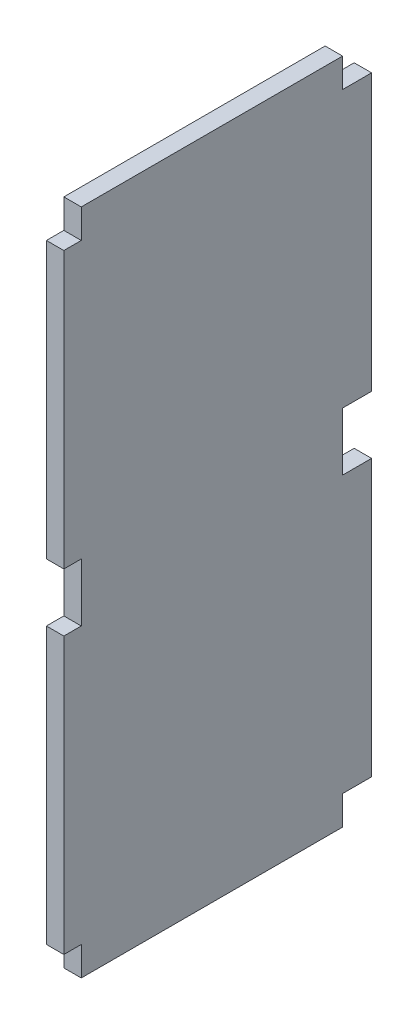
ISO-10303-21;
HEADER;
FILE_DESCRIPTION(('STEP AP214'),'2;1');
FILE_NAME('part.step','',(''),(''),'','','');
FILE_SCHEMA(('AUTOMOTIVE_DESIGN { 1 0 10303 214 1 1 1 1 }'));
ENDSEC;
DATA;
#1=APPLICATION_CONTEXT('core data for automotive mechanical design processes');
#2=APPLICATION_PROTOCOL_DEFINITION('international standard','automotive_design',2000,#1);
#3=PRODUCT_CONTEXT('',#1,'mechanical');
#4=PRODUCT('Part','Part','',(#3));
#5=PRODUCT_RELATED_PRODUCT_CATEGORY('part','',(#4));
#6=PRODUCT_DEFINITION_FORMATION('','',#4);
#7=PRODUCT_DEFINITION_CONTEXT('part definition',#1,'design');
#8=PRODUCT_DEFINITION('design','',#6,#7);
#9=PRODUCT_DEFINITION_SHAPE('','',#8);
#10=(LENGTH_UNIT() NAMED_UNIT(*) SI_UNIT(.MILLI.,.METRE.));
#11=(NAMED_UNIT(*) PLANE_ANGLE_UNIT() SI_UNIT($,.RADIAN.));
#12=(NAMED_UNIT(*) SI_UNIT($,.STERADIAN.) SOLID_ANGLE_UNIT());
#13=UNCERTAINTY_MEASURE_WITH_UNIT(LENGTH_MEASURE(1.E-05),#10,'distance_accuracy_value','');
#14=(GEOMETRIC_REPRESENTATION_CONTEXT(3) GLOBAL_UNCERTAINTY_ASSIGNED_CONTEXT((#13)) GLOBAL_UNIT_ASSIGNED_CONTEXT((#10,
#11,#12)) REPRESENTATION_CONTEXT('',''));
#15=CARTESIAN_POINT('',(0.,0.,0.));
#16=DIRECTION('',(0.,0.,1.));
#17=DIRECTION('',(1.,0.,0.));
#18=AXIS2_PLACEMENT_3D('',#15,#16,#17);
#19=CARTESIAN_POINT('',(6.49999999999999,52.5,153.04284840007));
#20=DIRECTION('',(0.,-1.,0.));
#21=DIRECTION('',(0.,0.,-1.));
#22=AXIS2_PLACEMENT_3D('',#19,#20,#21);
#23=PLANE('',#22);
#24=DIRECTION('',(0.,0.,-1.));
#25=VECTOR('',#24,1.);
#26=CARTESIAN_POINT('',(3.49999999999999,52.5,153.04284840007));
#27=LINE('',#26,#25);
#28=CARTESIAN_POINT('',(3.49999999999999,52.5,0.));
#29=VERTEX_POINT('',#28);
#30=CARTESIAN_POINT('',(3.49999999999999,52.5,-5.00000000000003));
#31=VERTEX_POINT('',#30);
#32=EDGE_CURVE('E213',#29,#31,#27,.T.);
#33=ORIENTED_EDGE('',*,*,#32,.F.);
#34=DIRECTION('',(1.,0.,0.));
#35=VECTOR('',#34,1.);
#36=CARTESIAN_POINT('',(3.49999999999999,52.5,0.));
#37=LINE('',#36,#35);
#38=CARTESIAN_POINT('',(6.50000000000004,52.5,0.));
#39=VERTEX_POINT('',#38);
#40=EDGE_CURVE('E197',#29,#39,#37,.T.);
#41=ORIENTED_EDGE('',*,*,#40,.T.);
#42=DIRECTION('',(0.,0.,-1.));
#43=VECTOR('',#42,1.);
#44=CARTESIAN_POINT('',(6.49999999999999,52.5,153.04284840007));
#45=LINE('',#44,#43);
#46=CARTESIAN_POINT('',(6.49999999999999,52.5,-5.));
#47=VERTEX_POINT('',#46);
#48=EDGE_CURVE('E241',#39,#47,#45,.T.);
#49=ORIENTED_EDGE('',*,*,#48,.T.);
#50=DIRECTION('',(1.,0.,0.));
#51=VECTOR('',#50,1.);
#52=CARTESIAN_POINT('',(6.49999999999999,52.5,-5.));
#53=LINE('',#52,#51);
#54=EDGE_CURVE('E237',#31,#47,#53,.T.);
#55=ORIENTED_EDGE('',*,*,#54,.F.);
#56=EDGE_LOOP('',(#33,#41,#49,#55));
#57=FACE_BOUND('',#56,.T.);
#58=ADVANCED_FACE('F39',(#57),#23,.F.);
#59=CARTESIAN_POINT('',(6.50000000000001,-52.5,153.04284840007));
#60=DIRECTION('',(0.,1.,0.));
#61=DIRECTION('',(0.,0.,1.));
#62=AXIS2_PLACEMENT_3D('',#59,#60,#61);
#63=PLANE('',#62);
#64=DIRECTION('',(-1.,0.,0.));
#65=VECTOR('',#64,1.);
#66=CARTESIAN_POINT('',(3.49999999999999,-52.5,45.));
#67=LINE('',#66,#65);
#68=CARTESIAN_POINT('',(6.50000000000001,-52.5,45.));
#69=VERTEX_POINT('',#68);
#70=CARTESIAN_POINT('',(3.5,-52.5,45.));
#71=VERTEX_POINT('',#70);
#72=EDGE_CURVE('E64',#69,#71,#67,.T.);
#73=ORIENTED_EDGE('',*,*,#72,.F.);
#74=DIRECTION('',(0.,0.,-1.));
#75=VECTOR('',#74,1.);
#76=CARTESIAN_POINT('',(6.50000000000001,-52.5,153.04284840007));
#77=LINE('',#76,#75);
#78=CARTESIAN_POINT('',(6.50000000000001,-52.5,48.));
#79=VERTEX_POINT('',#78);
#80=EDGE_CURVE('E246',#79,#69,#77,.T.);
#81=ORIENTED_EDGE('',*,*,#80,.F.);
#82=DIRECTION('',(1.,0.,0.));
#83=VECTOR('',#82,1.);
#84=CARTESIAN_POINT('',(6.50000000000001,-52.5,48.));
#85=LINE('',#84,#83);
#86=CARTESIAN_POINT('',(3.5,-52.5,48.));
#87=VERTEX_POINT('',#86);
#88=EDGE_CURVE('E254',#87,#79,#85,.T.);
#89=ORIENTED_EDGE('',*,*,#88,.F.);
#90=DIRECTION('',(0.,0.,-1.));
#91=VECTOR('',#90,1.);
#92=CARTESIAN_POINT('',(3.5,-52.5,153.04284840007));
#93=LINE('',#92,#91);
#94=EDGE_CURVE('E268',#87,#71,#93,.T.);
#95=ORIENTED_EDGE('',*,*,#94,.T.);
#96=EDGE_LOOP('',(#73,#81,#89,#95));
#97=FACE_BOUND('',#96,.T.);
#98=ADVANCED_FACE('F311',(#97),#63,.F.);
#99=DIRECTION('',(1.,0.,0.));
#100=VECTOR('',#99,1.);
#101=CARTESIAN_POINT('',(3.49999999999999,-52.5,0.));
#102=LINE('',#101,#100);
#103=CARTESIAN_POINT('',(3.5,-52.5,0.));
#104=VERTEX_POINT('',#103);
#105=CARTESIAN_POINT('',(6.50000000000004,-52.5,0.));
#106=VERTEX_POINT('',#105);
#107=EDGE_CURVE('E186',#104,#106,#102,.T.);
#108=ORIENTED_EDGE('',*,*,#107,.F.);
#109=CARTESIAN_POINT('',(3.5,-52.5,-5.));
#110=VERTEX_POINT('',#109);
#111=EDGE_CURVE('E239',#104,#110,#93,.T.);
#112=ORIENTED_EDGE('',*,*,#111,.T.);
#113=DIRECTION('',(-1.,0.,0.));
#114=VECTOR('',#113,1.);
#115=CARTESIAN_POINT('',(6.50000000000001,-52.5,-5.));
#116=LINE('',#115,#114);
#117=CARTESIAN_POINT('',(6.50000000000001,-52.5,-5.));
#118=VERTEX_POINT('',#117);
#119=EDGE_CURVE('E348',#118,#110,#116,.T.);
#120=ORIENTED_EDGE('',*,*,#119,.F.);
#121=EDGE_CURVE('E315',#106,#118,#77,.T.);
#122=ORIENTED_EDGE('',*,*,#121,.F.);
#123=EDGE_LOOP('',(#108,#112,#120,#122));
#124=FACE_BOUND('',#123,.T.);
#125=ADVANCED_FACE('F362',(#124),#63,.F.);
#126=CARTESIAN_POINT('',(0.,0.,-5.));
#127=DIRECTION('',(0.,0.,1.));
#128=DIRECTION('',(0.,-1.,0.));
#129=AXIS2_PLACEMENT_3D('',#126,#127,#128);
#130=PLANE('',#129);
#131=DIRECTION('',(0.,1.,0.));
#132=VECTOR('',#131,1.);
#133=CARTESIAN_POINT('',(3.49999999999999,52.5,-5.));
#134=LINE('',#133,#132);
#135=CARTESIAN_POINT('',(3.49999999999999,-5.,-5.));
#136=VERTEX_POINT('',#135);
#137=EDGE_CURVE('E345',#110,#136,#134,.T.);
#138=ORIENTED_EDGE('',*,*,#137,.T.);
#139=DIRECTION('',(1.,0.,0.));
#140=VECTOR('',#139,1.);
#141=CARTESIAN_POINT('',(0.,-5.,-5.));
#142=LINE('',#141,#140);
#143=CARTESIAN_POINT('',(6.5,-5.,-5.));
#144=VERTEX_POINT('',#143);
#145=EDGE_CURVE('E48',#136,#144,#142,.T.);
#146=ORIENTED_EDGE('',*,*,#145,.T.);
#147=DIRECTION('',(0.,-1.,0.));
#148=VECTOR('',#147,1.);
#149=CARTESIAN_POINT('',(6.49999999999999,52.5,-5.));
#150=LINE('',#149,#148);
#151=EDGE_CURVE('E350',#144,#118,#150,.T.);
#152=ORIENTED_EDGE('',*,*,#151,.T.);
#153=ORIENTED_EDGE('',*,*,#119,.T.);
#154=EDGE_LOOP('',(#138,#146,#152,#153));
#155=FACE_BOUND('',#154,.T.);
#156=ADVANCED_FACE('F358',(#155),#130,.F.);
#157=CARTESIAN_POINT('',(0.,0.,48.));
#158=DIRECTION('',(0.,0.,1.));
#159=DIRECTION('',(0.,-1.,0.));
#160=AXIS2_PLACEMENT_3D('',#157,#158,#159);
#161=PLANE('',#160);
#162=DIRECTION('',(-1.,0.,0.));
#163=VECTOR('',#162,1.);
#164=CARTESIAN_POINT('',(0.,5.,48.));
#165=LINE('',#164,#163);
#166=CARTESIAN_POINT('',(6.5,5.,48.));
#167=VERTEX_POINT('',#166);
#168=CARTESIAN_POINT('',(3.49999999999999,5.,48.));
#169=VERTEX_POINT('',#168);
#170=EDGE_CURVE('E278',#167,#169,#165,.T.);
#171=ORIENTED_EDGE('',*,*,#170,.F.);
#172=DIRECTION('',(0.,1.,0.));
#173=VECTOR('',#172,1.);
#174=CARTESIAN_POINT('',(6.49999999999999,52.5,48.));
#175=LINE('',#174,#173);
#176=CARTESIAN_POINT('',(6.49999999999999,52.5,48.));
#177=VERTEX_POINT('',#176);
#178=EDGE_CURVE('E302',#167,#177,#175,.T.);
#179=ORIENTED_EDGE('',*,*,#178,.T.);
#180=DIRECTION('',(-1.,0.,0.));
#181=VECTOR('',#180,1.);
#182=CARTESIAN_POINT('',(6.49999999999999,52.5,48.));
#183=LINE('',#182,#181);
#184=CARTESIAN_POINT('',(3.49999999999999,52.5,48.));
#185=VERTEX_POINT('',#184);
#186=EDGE_CURVE('E296',#177,#185,#183,.T.);
#187=ORIENTED_EDGE('',*,*,#186,.T.);
#188=DIRECTION('',(0.,-1.,0.));
#189=VECTOR('',#188,1.);
#190=CARTESIAN_POINT('',(3.49999999999999,52.5,48.));
#191=LINE('',#190,#189);
#192=EDGE_CURVE('E281',#185,#169,#191,.T.);
#193=ORIENTED_EDGE('',*,*,#192,.T.);
#194=EDGE_LOOP('',(#171,#179,#187,#193));
#195=FACE_BOUND('',#194,.T.);
#196=ADVANCED_FACE('F440',(#195),#161,.T.);
#197=CARTESIAN_POINT('',(6.49999999999999,52.5,153.04284840007));
#198=DIRECTION('',(-1.,0.,0.));
#199=DIRECTION('',(0.,-1.,0.));
#200=AXIS2_PLACEMENT_3D('',#197,#198,#199);
#201=PLANE('',#200);
#202=ORIENTED_EDGE('',*,*,#151,.F.);
#203=DIRECTION('',(0.,0.,-1.));
#204=VECTOR('',#203,1.);
#205=CARTESIAN_POINT('',(6.5,-5.,-5.));
#206=LINE('',#205,#204);
#207=CARTESIAN_POINT('',(6.5,-5.,0.));
#208=VERTEX_POINT('',#207);
#209=EDGE_CURVE('E400',#208,#144,#206,.T.);
#210=ORIENTED_EDGE('',*,*,#209,.F.);
#211=DIRECTION('',(0.,-1.,0.));
#212=VECTOR('',#211,1.);
#213=CARTESIAN_POINT('',(6.5,0.,0.));
#214=LINE('',#213,#212);
#215=CARTESIAN_POINT('',(6.5,5.,0.));
#216=VERTEX_POINT('',#215);
#217=EDGE_CURVE('E379',#216,#208,#214,.T.);
#218=ORIENTED_EDGE('',*,*,#217,.F.);
#219=DIRECTION('',(0.,0.,1.));
#220=VECTOR('',#219,1.);
#221=CARTESIAN_POINT('',(6.5,5.00000000000001,-5.));
#222=LINE('',#221,#220);
#223=CARTESIAN_POINT('',(6.5,5.00000000000001,-5.));
#224=VERTEX_POINT('',#223);
#225=EDGE_CURVE('E375',#224,#216,#222,.T.);
#226=ORIENTED_EDGE('',*,*,#225,.F.);
#227=EDGE_CURVE('E351',#47,#224,#150,.T.);
#228=ORIENTED_EDGE('',*,*,#227,.F.);
#229=ORIENTED_EDGE('',*,*,#48,.F.);
#230=DIRECTION('',(0.,-1.,0.));
#231=VECTOR('',#230,1.);
#232=CARTESIAN_POINT('',(6.50000000000004,57.5,0.));
#233=LINE('',#232,#231);
#234=CARTESIAN_POINT('',(6.50000000000004,57.5,0.));
#235=VERTEX_POINT('',#234);
#236=EDGE_CURVE('E220',#235,#39,#233,.T.);
#237=ORIENTED_EDGE('',*,*,#236,.F.);
#238=DIRECTION('',(0.,0.,1.));
#239=VECTOR('',#238,1.);
#240=CARTESIAN_POINT('',(6.50000000000004,57.5,0.));
#241=LINE('',#240,#239);
#242=CARTESIAN_POINT('',(6.50000000000004,57.5,45.));
#243=VERTEX_POINT('',#242);
#244=EDGE_CURVE('E200',#235,#243,#241,.T.);
#245=ORIENTED_EDGE('',*,*,#244,.T.);
#246=DIRECTION('',(0.,-1.,0.));
#247=VECTOR('',#246,1.);
#248=CARTESIAN_POINT('',(6.50000000000004,57.5,45.));
#249=LINE('',#248,#247);
#250=CARTESIAN_POINT('',(6.50000000000004,52.5,45.));
#251=VERTEX_POINT('',#250);
#252=EDGE_CURVE('E187',#243,#251,#249,.T.);
#253=ORIENTED_EDGE('',*,*,#252,.T.);
#254=EDGE_CURVE('E238',#177,#251,#45,.T.);
#255=ORIENTED_EDGE('',*,*,#254,.F.);
#256=ORIENTED_EDGE('',*,*,#178,.F.);
#257=DIRECTION('',(0.,0.,1.));
#258=VECTOR('',#257,1.);
#259=CARTESIAN_POINT('',(6.5,5.,48.));
#260=LINE('',#259,#258);
#261=CARTESIAN_POINT('',(6.5,5.,45.));
#262=VERTEX_POINT('',#261);
#263=EDGE_CURVE('E326',#262,#167,#260,.T.);
#264=ORIENTED_EDGE('',*,*,#263,.F.);
#265=DIRECTION('',(0.,1.,0.));
#266=VECTOR('',#265,1.);
#267=CARTESIAN_POINT('',(6.5,5.,45.));
#268=LINE('',#267,#266);
#269=CARTESIAN_POINT('',(6.5,-5.,45.));
#270=VERTEX_POINT('',#269);
#271=EDGE_CURVE('E322',#270,#262,#268,.T.);
#272=ORIENTED_EDGE('',*,*,#271,.F.);
#273=DIRECTION('',(0.,0.,-1.));
#274=VECTOR('',#273,1.);
#275=CARTESIAN_POINT('',(6.5,-5.,48.));
#276=LINE('',#275,#274);
#277=CARTESIAN_POINT('',(6.5,-5.,48.));
#278=VERTEX_POINT('',#277);
#279=EDGE_CURVE('E319',#278,#270,#276,.T.);
#280=ORIENTED_EDGE('',*,*,#279,.F.);
#281=EDGE_CURVE('E300',#79,#278,#175,.T.);
#282=ORIENTED_EDGE('',*,*,#281,.F.);
#283=ORIENTED_EDGE('',*,*,#80,.T.);
#284=DIRECTION('',(0.,1.,0.));
#285=VECTOR('',#284,1.);
#286=CARTESIAN_POINT('',(6.50000000000004,-57.5,45.));
#287=LINE('',#286,#285);
#288=CARTESIAN_POINT('',(6.50000000000004,-57.5,45.));
#289=VERTEX_POINT('',#288);
#290=EDGE_CURVE('E381',#289,#69,#287,.T.);
#291=ORIENTED_EDGE('',*,*,#290,.F.);
#292=DIRECTION('',(0.,0.,1.));
#293=VECTOR('',#292,1.);
#294=CARTESIAN_POINT('',(6.50000000000004,-57.5,0.));
#295=LINE('',#294,#293);
#296=CARTESIAN_POINT('',(6.50000000000004,-57.5,0.));
#297=VERTEX_POINT('',#296);
#298=EDGE_CURVE('E472',#297,#289,#295,.T.);
#299=ORIENTED_EDGE('',*,*,#298,.F.);
#300=DIRECTION('',(0.,1.,0.));
#301=VECTOR('',#300,1.);
#302=CARTESIAN_POINT('',(6.50000000000004,-57.5,0.));
#303=LINE('',#302,#301);
#304=EDGE_CURVE('E376',#297,#106,#303,.T.);
#305=ORIENTED_EDGE('',*,*,#304,.T.);
#306=ORIENTED_EDGE('',*,*,#121,.T.);
#307=EDGE_LOOP('',(#202,#210,#218,#226,#228,#229,#237,#245,#253,#255,#256,#264,#272,#280,#282,
#283,#291,#299,#305,#306));
#308=FACE_BOUND('',#307,.T.);
#309=ADVANCED_FACE('F317',(#308),#201,.F.);
#310=ORIENTED_EDGE('',*,*,#254,.T.);
#311=DIRECTION('',(-1.,0.,0.));
#312=VECTOR('',#311,1.);
#313=CARTESIAN_POINT('',(3.49999999999999,52.5,45.));
#314=LINE('',#313,#312);
#315=CARTESIAN_POINT('',(3.49999999999999,52.5,45.));
#316=VERTEX_POINT('',#315);
#317=EDGE_CURVE('E211',#251,#316,#314,.T.);
#318=ORIENTED_EDGE('',*,*,#317,.T.);
#319=EDGE_CURVE('E185',#185,#316,#27,.T.);
#320=ORIENTED_EDGE('',*,*,#319,.F.);
#321=ORIENTED_EDGE('',*,*,#186,.F.);
#322=EDGE_LOOP('',(#310,#318,#320,#321));
#323=FACE_BOUND('',#322,.T.);
#324=ADVANCED_FACE('F429',(#323),#23,.F.);
#325=CARTESIAN_POINT('',(3.49999999999999,52.5,153.04284840007));
#326=DIRECTION('',(1.,0.,0.));
#327=DIRECTION('',(0.,1.,0.));
#328=AXIS2_PLACEMENT_3D('',#325,#326,#327);
#329=PLANE('',#328);
#330=DIRECTION('',(0.,-1.,0.));
#331=VECTOR('',#330,1.);
#332=CARTESIAN_POINT('',(3.49999999999999,52.5,0.));
#333=LINE('',#332,#331);
#334=CARTESIAN_POINT('',(3.49999999999999,5.,0.));
#335=VERTEX_POINT('',#334);
#336=CARTESIAN_POINT('',(3.5,-5.,0.));
#337=VERTEX_POINT('',#336);
#338=EDGE_CURVE('E11',#335,#337,#333,.T.);
#339=ORIENTED_EDGE('',*,*,#338,.T.);
#340=DIRECTION('',(0.,0.,-1.));
#341=VECTOR('',#340,1.);
#342=CARTESIAN_POINT('',(3.5,-4.99999999999992,153.04284840007));
#343=LINE('',#342,#341);
#344=EDGE_CURVE('E324',#337,#136,#343,.T.);
#345=ORIENTED_EDGE('',*,*,#344,.T.);
#346=ORIENTED_EDGE('',*,*,#137,.F.);
#347=ORIENTED_EDGE('',*,*,#111,.F.);
#348=DIRECTION('',(0.,1.,0.));
#349=VECTOR('',#348,1.);
#350=CARTESIAN_POINT('',(3.49999999999999,-57.5,0.));
#351=LINE('',#350,#349);
#352=CARTESIAN_POINT('',(3.49999999999999,-57.5,0.));
#353=VERTEX_POINT('',#352);
#354=EDGE_CURVE('E368',#353,#104,#351,.T.);
#355=ORIENTED_EDGE('',*,*,#354,.F.);
#356=DIRECTION('',(0.,0.,-1.));
#357=VECTOR('',#356,1.);
#358=CARTESIAN_POINT('',(3.49999999999999,-57.5,0.));
#359=LINE('',#358,#357);
#360=CARTESIAN_POINT('',(3.49999999999999,-57.5,45.));
#361=VERTEX_POINT('',#360);
#362=EDGE_CURVE('E390',#361,#353,#359,.T.);
#363=ORIENTED_EDGE('',*,*,#362,.F.);
#364=DIRECTION('',(0.,1.,0.));
#365=VECTOR('',#364,1.);
#366=CARTESIAN_POINT('',(3.49999999999999,-57.5,45.));
#367=LINE('',#366,#365);
#368=EDGE_CURVE('E391',#361,#71,#367,.T.);
#369=ORIENTED_EDGE('',*,*,#368,.T.);
#370=ORIENTED_EDGE('',*,*,#94,.F.);
#371=CARTESIAN_POINT('',(3.5,-5.,48.));
#372=VERTEX_POINT('',#371);
#373=EDGE_CURVE('E288',#372,#87,#191,.T.);
#374=ORIENTED_EDGE('',*,*,#373,.F.);
#375=DIRECTION('',(0.,0.,-1.));
#376=VECTOR('',#375,1.);
#377=CARTESIAN_POINT('',(3.5,-5.,153.04284840007));
#378=LINE('',#377,#376);
#379=CARTESIAN_POINT('',(3.5,-5.,45.));
#380=VERTEX_POINT('',#379);
#381=EDGE_CURVE('E337',#372,#380,#378,.T.);
#382=ORIENTED_EDGE('',*,*,#381,.T.);
#383=DIRECTION('',(0.,1.,0.));
#384=VECTOR('',#383,1.);
#385=CARTESIAN_POINT('',(3.49999999999999,52.5,45.));
#386=LINE('',#385,#384);
#387=CARTESIAN_POINT('',(3.5,5.,45.));
#388=VERTEX_POINT('',#387);
#389=EDGE_CURVE('E275',#380,#388,#386,.T.);
#390=ORIENTED_EDGE('',*,*,#389,.T.);
#391=DIRECTION('',(0.,0.,1.));
#392=VECTOR('',#391,1.);
#393=CARTESIAN_POINT('',(3.49999999999999,5.00000000000002,153.04284840007));
#394=LINE('',#393,#392);
#395=EDGE_CURVE('E341',#388,#169,#394,.T.);
#396=ORIENTED_EDGE('',*,*,#395,.T.);
#397=ORIENTED_EDGE('',*,*,#192,.F.);
#398=ORIENTED_EDGE('',*,*,#319,.T.);
#399=DIRECTION('',(0.,-1.,0.));
#400=VECTOR('',#399,1.);
#401=CARTESIAN_POINT('',(3.49999999999999,57.5,45.));
#402=LINE('',#401,#400);
#403=CARTESIAN_POINT('',(3.49999999999999,57.5,45.));
#404=VERTEX_POINT('',#403);
#405=EDGE_CURVE('E56',#404,#316,#402,.T.);
#406=ORIENTED_EDGE('',*,*,#405,.F.);
#407=DIRECTION('',(0.,0.,-1.));
#408=VECTOR('',#407,1.);
#409=CARTESIAN_POINT('',(3.49999999999999,57.5,0.));
#410=LINE('',#409,#408);
#411=CARTESIAN_POINT('',(3.49999999999999,57.5,0.));
#412=VERTEX_POINT('',#411);
#413=EDGE_CURVE('E182',#404,#412,#410,.T.);
#414=ORIENTED_EDGE('',*,*,#413,.T.);
#415=DIRECTION('',(0.,-1.,0.));
#416=VECTOR('',#415,1.);
#417=CARTESIAN_POINT('',(3.49999999999999,57.5,0.));
#418=LINE('',#417,#416);
#419=EDGE_CURVE('E205',#412,#29,#418,.T.);
#420=ORIENTED_EDGE('',*,*,#419,.T.);
#421=ORIENTED_EDGE('',*,*,#32,.T.);
#422=CARTESIAN_POINT('',(3.49999999999999,5.,-5.));
#423=VERTEX_POINT('',#422);
#424=EDGE_CURVE('E344',#423,#31,#134,.T.);
#425=ORIENTED_EDGE('',*,*,#424,.F.);
#426=DIRECTION('',(0.,0.,1.));
#427=VECTOR('',#426,1.);
#428=CARTESIAN_POINT('',(3.49999999999999,4.99999999999992,153.04284840007));
#429=LINE('',#428,#427);
#430=EDGE_CURVE('E329',#423,#335,#429,.T.);
#431=ORIENTED_EDGE('',*,*,#430,.T.);
#432=EDGE_LOOP('',(#339,#345,#346,#347,#355,#363,#369,#370,#374,#382,#390,#396,#397,#398,#406,
#414,#420,#421,#425,#431));
#433=FACE_BOUND('',#432,.T.);
#434=ADVANCED_FACE('F181',(#433),#329,.F.);
#435=DIRECTION('',(1.,0.,0.));
#436=VECTOR('',#435,1.);
#437=CARTESIAN_POINT('',(0.,-5.,48.));
#438=LINE('',#437,#436);
#439=EDGE_CURVE('E280',#372,#278,#438,.T.);
#440=ORIENTED_EDGE('',*,*,#439,.F.);
#441=ORIENTED_EDGE('',*,*,#373,.T.);
#442=ORIENTED_EDGE('',*,*,#88,.T.);
#443=ORIENTED_EDGE('',*,*,#281,.T.);
#444=EDGE_LOOP('',(#440,#441,#442,#443));
#445=FACE_BOUND('',#444,.T.);
#446=ADVANCED_FACE('F41',(#445),#161,.T.);
#447=ORIENTED_EDGE('',*,*,#227,.T.);
#448=DIRECTION('',(-1.,0.,0.));
#449=VECTOR('',#448,1.);
#450=CARTESIAN_POINT('',(0.,5.,-5.));
#451=LINE('',#450,#449);
#452=EDGE_CURVE('E272',#224,#423,#451,.T.);
#453=ORIENTED_EDGE('',*,*,#452,.T.);
#454=ORIENTED_EDGE('',*,*,#424,.T.);
#455=ORIENTED_EDGE('',*,*,#54,.T.);
#456=EDGE_LOOP('',(#447,#453,#454,#455));
#457=FACE_BOUND('',#456,.T.);
#458=ADVANCED_FACE('F410',(#457),#130,.F.);
#459=CARTESIAN_POINT('',(-3.5,5.,45.));
#460=DIRECTION('',(0.,0.,-1.));
#461=DIRECTION('',(-1.,0.,0.));
#462=AXIS2_PLACEMENT_3D('',#459,#460,#461);
#463=PLANE('',#462);
#464=DIRECTION('',(1.,0.,0.));
#465=VECTOR('',#464,1.);
#466=CARTESIAN_POINT('',(-3.5,-5.,45.));
#467=LINE('',#466,#465);
#468=EDGE_CURVE('E334',#380,#270,#467,.T.);
#469=ORIENTED_EDGE('',*,*,#468,.T.);
#470=ORIENTED_EDGE('',*,*,#271,.T.);
#471=DIRECTION('',(1.,0.,0.));
#472=VECTOR('',#471,1.);
#473=CARTESIAN_POINT('',(-3.5,5.,45.));
#474=LINE('',#473,#472);
#475=EDGE_CURVE('E335',#388,#262,#474,.T.);
#476=ORIENTED_EDGE('',*,*,#475,.F.);
#477=ORIENTED_EDGE('',*,*,#389,.F.);
#478=EDGE_LOOP('',(#469,#470,#476,#477));
#479=FACE_BOUND('',#478,.T.);
#480=ADVANCED_FACE('F452',(#479),#463,.F.);
#481=CARTESIAN_POINT('',(-3.5,5.,48.));
#482=DIRECTION('',(0.,1.,0.));
#483=DIRECTION('',(0.,0.,1.));
#484=AXIS2_PLACEMENT_3D('',#481,#482,#483);
#485=PLANE('',#484);
#486=ORIENTED_EDGE('',*,*,#475,.T.);
#487=ORIENTED_EDGE('',*,*,#263,.T.);
#488=ORIENTED_EDGE('',*,*,#170,.T.);
#489=ORIENTED_EDGE('',*,*,#395,.F.);
#490=EDGE_LOOP('',(#486,#487,#488,#489));
#491=FACE_BOUND('',#490,.T.);
#492=ADVANCED_FACE('F456',(#491),#485,.F.);
#493=CARTESIAN_POINT('',(-3.5,-5.,48.));
#494=DIRECTION('',(0.,-1.,0.));
#495=DIRECTION('',(1.,0.,0.));
#496=AXIS2_PLACEMENT_3D('',#493,#494,#495);
#497=PLANE('',#496);
#498=ORIENTED_EDGE('',*,*,#439,.T.);
#499=ORIENTED_EDGE('',*,*,#279,.T.);
#500=ORIENTED_EDGE('',*,*,#468,.F.);
#501=ORIENTED_EDGE('',*,*,#381,.F.);
#502=EDGE_LOOP('',(#498,#499,#500,#501));
#503=FACE_BOUND('',#502,.T.);
#504=ADVANCED_FACE('F424',(#503),#497,.F.);
#505=CARTESIAN_POINT('',(-3.5,0.,0.));
#506=DIRECTION('',(0.,0.,1.));
#507=DIRECTION('',(1.,0.,0.));
#508=AXIS2_PLACEMENT_3D('',#505,#506,#507);
#509=PLANE('',#508);
#510=DIRECTION('',(1.,0.,0.));
#511=VECTOR('',#510,1.);
#512=CARTESIAN_POINT('',(-3.5,5.,0.));
#513=LINE('',#512,#511);
#514=EDGE_CURVE('E402',#335,#216,#513,.T.);
#515=ORIENTED_EDGE('',*,*,#514,.T.);
#516=ORIENTED_EDGE('',*,*,#217,.T.);
#517=DIRECTION('',(1.,0.,0.));
#518=VECTOR('',#517,1.);
#519=CARTESIAN_POINT('',(-3.5,-5.,0.));
#520=LINE('',#519,#518);
#521=EDGE_CURVE('E403',#337,#208,#520,.T.);
#522=ORIENTED_EDGE('',*,*,#521,.F.);
#523=ORIENTED_EDGE('',*,*,#338,.F.);
#524=EDGE_LOOP('',(#515,#516,#522,#523));
#525=FACE_BOUND('',#524,.T.);
#526=ADVANCED_FACE('F414',(#525),#509,.F.);
#527=CARTESIAN_POINT('',(-3.5,-5.,-5.));
#528=DIRECTION('',(0.,-1.,0.));
#529=DIRECTION('',(0.,0.,-1.));
#530=AXIS2_PLACEMENT_3D('',#527,#528,#529);
#531=PLANE('',#530);
#532=ORIENTED_EDGE('',*,*,#521,.T.);
#533=ORIENTED_EDGE('',*,*,#209,.T.);
#534=ORIENTED_EDGE('',*,*,#145,.F.);
#535=ORIENTED_EDGE('',*,*,#344,.F.);
#536=EDGE_LOOP('',(#532,#533,#534,#535));
#537=FACE_BOUND('',#536,.T.);
#538=ADVANCED_FACE('F416',(#537),#531,.F.);
#539=CARTESIAN_POINT('',(-3.5,5.,-5.));
#540=DIRECTION('',(0.,1.,0.));
#541=DIRECTION('',(0.,0.,1.));
#542=AXIS2_PLACEMENT_3D('',#539,#540,#541);
#543=PLANE('',#542);
#544=ORIENTED_EDGE('',*,*,#452,.F.);
#545=ORIENTED_EDGE('',*,*,#225,.T.);
#546=ORIENTED_EDGE('',*,*,#514,.F.);
#547=ORIENTED_EDGE('',*,*,#430,.F.);
#548=EDGE_LOOP('',(#544,#545,#546,#547));
#549=FACE_BOUND('',#548,.T.);
#550=ADVANCED_FACE('F408',(#549),#543,.F.);
#551=CARTESIAN_POINT('',(3.49999999999999,-57.5,0.));
#552=DIRECTION('',(0.,0.,1.));
#553=DIRECTION('',(1.,0.,0.));
#554=AXIS2_PLACEMENT_3D('',#551,#552,#553);
#555=PLANE('',#554);
#556=ORIENTED_EDGE('',*,*,#107,.T.);
#557=ORIENTED_EDGE('',*,*,#304,.F.);
#558=DIRECTION('',(1.,0.,0.));
#559=VECTOR('',#558,1.);
#560=CARTESIAN_POINT('',(3.49999999999999,-57.5,0.));
#561=LINE('',#560,#559);
#562=EDGE_CURVE('E373',#353,#297,#561,.T.);
#563=ORIENTED_EDGE('',*,*,#562,.F.);
#564=ORIENTED_EDGE('',*,*,#354,.T.);
#565=EDGE_LOOP('',(#556,#557,#563,#564));
#566=FACE_BOUND('',#565,.T.);
#567=ADVANCED_FACE('F370',(#566),#555,.F.);
#568=CARTESIAN_POINT('',(3.49999999999999,-57.5,45.));
#569=DIRECTION('',(0.,0.,-1.));
#570=DIRECTION('',(-1.,0.,0.));
#571=AXIS2_PLACEMENT_3D('',#568,#569,#570);
#572=PLANE('',#571);
#573=ORIENTED_EDGE('',*,*,#72,.T.);
#574=ORIENTED_EDGE('',*,*,#368,.F.);
#575=DIRECTION('',(-1.,0.,0.));
#576=VECTOR('',#575,1.);
#577=CARTESIAN_POINT('',(3.49999999999999,-57.5,45.));
#578=LINE('',#577,#576);
#579=EDGE_CURVE('E471',#289,#361,#578,.T.);
#580=ORIENTED_EDGE('',*,*,#579,.F.);
#581=ORIENTED_EDGE('',*,*,#290,.T.);
#582=EDGE_LOOP('',(#573,#574,#580,#581));
#583=FACE_BOUND('',#582,.T.);
#584=ADVANCED_FACE('F478',(#583),#572,.F.);
#585=CARTESIAN_POINT('',(0.,-57.5,0.));
#586=DIRECTION('',(0.,1.,0.));
#587=DIRECTION('',(0.,0.,1.));
#588=AXIS2_PLACEMENT_3D('',#585,#586,#587);
#589=PLANE('',#588);
#590=ORIENTED_EDGE('',*,*,#362,.T.);
#591=ORIENTED_EDGE('',*,*,#562,.T.);
#592=ORIENTED_EDGE('',*,*,#298,.T.);
#593=ORIENTED_EDGE('',*,*,#579,.T.);
#594=EDGE_LOOP('',(#590,#591,#592,#593));
#595=FACE_BOUND('',#594,.T.);
#596=ADVANCED_FACE('F476',(#595),#589,.F.);
#597=CARTESIAN_POINT('',(3.49999999999999,57.5,45.));
#598=DIRECTION('',(0.,0.,1.));
#599=DIRECTION('',(1.,0.,0.));
#600=AXIS2_PLACEMENT_3D('',#597,#598,#599);
#601=PLANE('',#600);
#602=ORIENTED_EDGE('',*,*,#317,.F.);
#603=ORIENTED_EDGE('',*,*,#252,.F.);
#604=DIRECTION('',(-1.,0.,0.));
#605=VECTOR('',#604,1.);
#606=CARTESIAN_POINT('',(3.49999999999999,57.5,45.));
#607=LINE('',#606,#605);
#608=EDGE_CURVE('E193',#243,#404,#607,.T.);
#609=ORIENTED_EDGE('',*,*,#608,.T.);
#610=ORIENTED_EDGE('',*,*,#405,.T.);
#611=EDGE_LOOP('',(#602,#603,#609,#610));
#612=FACE_BOUND('',#611,.T.);
#613=ADVANCED_FACE('F199',(#612),#601,.T.);
#614=CARTESIAN_POINT('',(3.49999999999999,57.5,0.));
#615=DIRECTION('',(0.,0.,-1.));
#616=DIRECTION('',(-1.,0.,0.));
#617=AXIS2_PLACEMENT_3D('',#614,#615,#616);
#618=PLANE('',#617);
#619=ORIENTED_EDGE('',*,*,#40,.F.);
#620=ORIENTED_EDGE('',*,*,#419,.F.);
#621=DIRECTION('',(1.,0.,0.));
#622=VECTOR('',#621,1.);
#623=CARTESIAN_POINT('',(3.49999999999999,57.5,0.));
#624=LINE('',#623,#622);
#625=EDGE_CURVE('E196',#412,#235,#624,.T.);
#626=ORIENTED_EDGE('',*,*,#625,.T.);
#627=ORIENTED_EDGE('',*,*,#236,.T.);
#628=EDGE_LOOP('',(#619,#620,#626,#627));
#629=FACE_BOUND('',#628,.T.);
#630=ADVANCED_FACE('F232',(#629),#618,.T.);
#631=CARTESIAN_POINT('',(0.,57.5,0.));
#632=DIRECTION('',(0.,-1.,0.));
#633=DIRECTION('',(0.,0.,1.));
#634=AXIS2_PLACEMENT_3D('',#631,#632,#633);
#635=PLANE('',#634);
#636=ORIENTED_EDGE('',*,*,#413,.F.);
#637=ORIENTED_EDGE('',*,*,#608,.F.);
#638=ORIENTED_EDGE('',*,*,#244,.F.);
#639=ORIENTED_EDGE('',*,*,#625,.F.);
#640=EDGE_LOOP('',(#636,#637,#638,#639));
#641=FACE_BOUND('',#640,.T.);
#642=ADVANCED_FACE('F191',(#641),#635,.F.);
#643=CLOSED_SHELL('',(#58,#98,#125,#156,#196,#309,#324,#434,#446,#458,#480,#492,#504,#526,#538,
#550,#567,#584,#596,#613,#630,#642));
#644=MANIFOLD_SOLID_BREP('B2',#643);
#645=ADVANCED_BREP_SHAPE_REPRESENTATION('',(#18,#644),#14);
#646=SHAPE_DEFINITION_REPRESENTATION(#9,#645);
ENDSEC;
END-ISO-10303-21;
